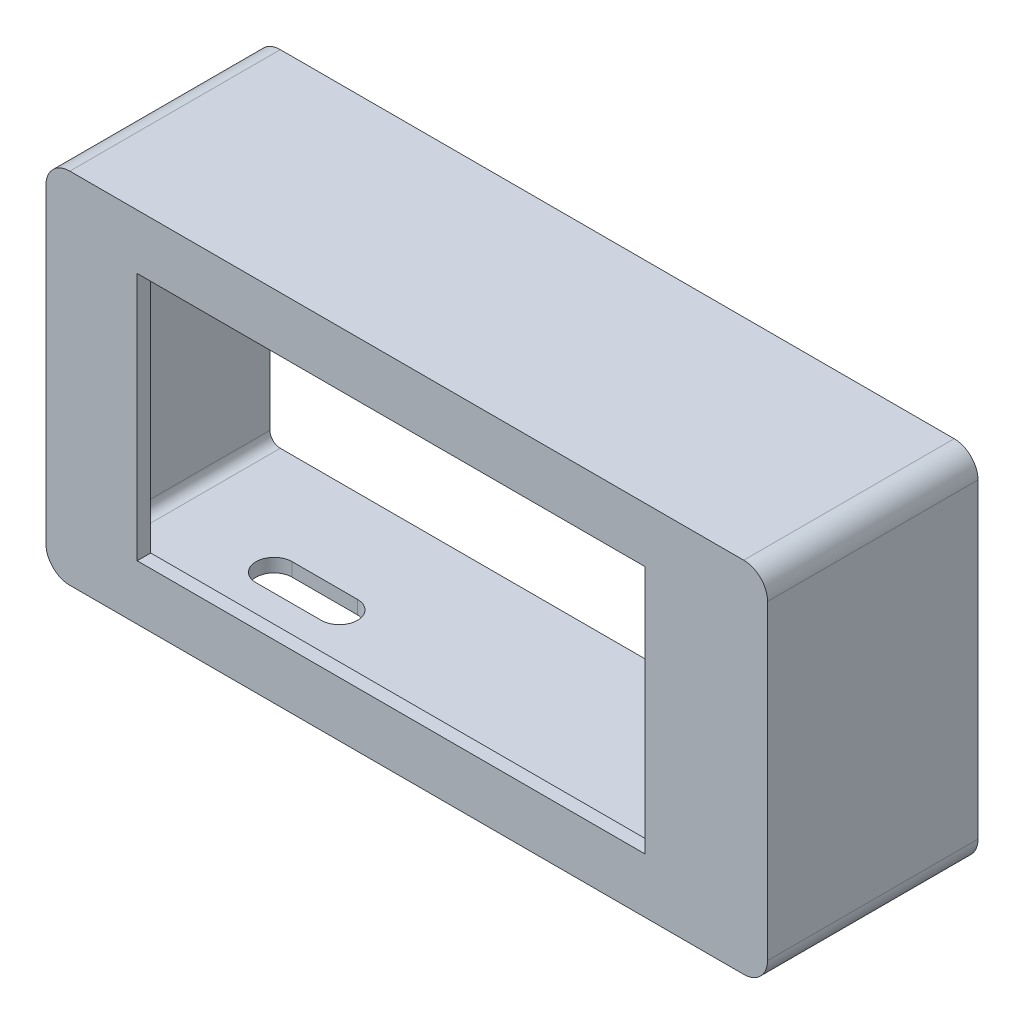
ISO-10303-21;
HEADER;
FILE_DESCRIPTION(('STEP AP214'),'2;1');
FILE_NAME('part.step','',(''),(''),'','','');
FILE_SCHEMA(('AUTOMOTIVE_DESIGN { 1 0 10303 214 1 1 1 1 }'));
ENDSEC;
DATA;
#1=APPLICATION_CONTEXT('core data for automotive mechanical design processes');
#2=APPLICATION_PROTOCOL_DEFINITION('international standard','automotive_design',2000,#1);
#3=PRODUCT_CONTEXT('',#1,'mechanical');
#4=PRODUCT('Part','Part','',(#3));
#5=PRODUCT_RELATED_PRODUCT_CATEGORY('part','',(#4));
#6=PRODUCT_DEFINITION_FORMATION('','',#4);
#7=PRODUCT_DEFINITION_CONTEXT('part definition',#1,'design');
#8=PRODUCT_DEFINITION('design','',#6,#7);
#9=PRODUCT_DEFINITION_SHAPE('','',#8);
#10=(LENGTH_UNIT() NAMED_UNIT(*) SI_UNIT(.MILLI.,.METRE.));
#11=(NAMED_UNIT(*) PLANE_ANGLE_UNIT() SI_UNIT($,.RADIAN.));
#12=(NAMED_UNIT(*) SI_UNIT($,.STERADIAN.) SOLID_ANGLE_UNIT());
#13=UNCERTAINTY_MEASURE_WITH_UNIT(LENGTH_MEASURE(1.E-05),#10,'distance_accuracy_value','');
#14=(GEOMETRIC_REPRESENTATION_CONTEXT(3) GLOBAL_UNCERTAINTY_ASSIGNED_CONTEXT((#13)) GLOBAL_UNIT_ASSIGNED_CONTEXT((#10,
#11,#12)) REPRESENTATION_CONTEXT('',''));
#15=CARTESIAN_POINT('',(0.,0.,0.));
#16=DIRECTION('',(0.,0.,1.));
#17=DIRECTION('',(1.,0.,0.));
#18=AXIS2_PLACEMENT_3D('',#15,#16,#17);
#19=CARTESIAN_POINT('',(67.,16.,9.5));
#20=DIRECTION('',(0.,-1.,0.));
#21=DIRECTION('',(0.,0.,-1.));
#22=AXIS2_PLACEMENT_3D('',#19,#20,#21);
#23=PLANE('',#22);
#24=DIRECTION('',(-1.,0.,0.));
#25=VECTOR('',#24,1.);
#26=CARTESIAN_POINT('',(67.,16.,-9.5));
#27=LINE('',#26,#25);
#28=CARTESIAN_POINT('',(66.,16.,-9.5));
#29=VERTEX_POINT('',#28);
#30=CARTESIAN_POINT('',(1.,16.,-9.5));
#31=VERTEX_POINT('',#30);
#32=EDGE_CURVE('E372',#29,#31,#27,.T.);
#33=ORIENTED_EDGE('',*,*,#32,.F.);
#34=DIRECTION('',(0.,0.,1.));
#35=VECTOR('',#34,1.);
#36=CARTESIAN_POINT('',(66.,16.,9.5));
#37=LINE('',#36,#35);
#38=CARTESIAN_POINT('',(66.,16.,9.5));
#39=VERTEX_POINT('',#38);
#40=EDGE_CURVE('E404',#39,#29,#37,.F.);
#41=ORIENTED_EDGE('',*,*,#40,.F.);
#42=DIRECTION('',(-1.,0.,0.));
#43=VECTOR('',#42,1.);
#44=CARTESIAN_POINT('',(67.,16.,9.5));
#45=LINE('',#44,#43);
#46=CARTESIAN_POINT('',(1.,16.,9.5));
#47=VERTEX_POINT('',#46);
#48=EDGE_CURVE('E369',#39,#47,#45,.T.);
#49=ORIENTED_EDGE('',*,*,#48,.T.);
#50=DIRECTION('',(0.,0.,1.));
#51=VECTOR('',#50,1.);
#52=CARTESIAN_POINT('',(1.,16.,9.5));
#53=LINE('',#52,#51);
#54=EDGE_CURVE('E407',#31,#47,#53,.T.);
#55=ORIENTED_EDGE('',*,*,#54,.F.);
#56=EDGE_LOOP('',(#33,#41,#49,#55));
#57=FACE_BOUND('',#56,.T.);
#58=DIRECTION('',(1.,0.,0.));
#59=VECTOR('',#58,1.);
#60=CARTESIAN_POINT('',(7.43067392756928,16.,1.));
#61=LINE('',#60,#59);
#62=CARTESIAN_POINT('',(7.43067392756928,16.,1.));
#63=VERTEX_POINT('',#62);
#64=CARTESIAN_POINT('',(13.2167778152242,16.,1.));
#65=VERTEX_POINT('',#64);
#66=EDGE_CURVE('E271',#63,#65,#61,.T.);
#67=ORIENTED_EDGE('',*,*,#66,.F.);
#68=DIRECTION('',(0.,0.,-1.));
#69=VECTOR('',#68,1.);
#70=CARTESIAN_POINT('',(7.43067392756928,16.,3.));
#71=LINE('',#70,#69);
#72=CARTESIAN_POINT('',(7.43067392756928,16.,3.));
#73=VERTEX_POINT('',#72);
#74=EDGE_CURVE('E268',#73,#63,#71,.T.);
#75=ORIENTED_EDGE('',*,*,#74,.F.);
#76=DIRECTION('',(-1.,0.,0.));
#77=VECTOR('',#76,1.);
#78=CARTESIAN_POINT('',(7.43067392756928,16.,3.));
#79=LINE('',#78,#77);
#80=CARTESIAN_POINT('',(13.2167778152242,16.,3.));
#81=VERTEX_POINT('',#80);
#82=EDGE_CURVE('E280',#81,#73,#79,.T.);
#83=ORIENTED_EDGE('',*,*,#82,.F.);
#84=DIRECTION('',(0.,0.,1.));
#85=VECTOR('',#84,1.);
#86=CARTESIAN_POINT('',(13.2167778152242,16.,3.));
#87=LINE('',#86,#85);
#88=EDGE_CURVE('E288',#65,#81,#87,.T.);
#89=ORIENTED_EDGE('',*,*,#88,.F.);
#90=EDGE_LOOP('',(#67,#75,#83,#89));
#91=FACE_BOUND('',#90,.T.);
#92=DIRECTION('',(1.,0.,0.));
#93=VECTOR('',#92,1.);
#94=CARTESIAN_POINT('',(55.2382145754227,16.,1.));
#95=LINE('',#94,#93);
#96=CARTESIAN_POINT('',(55.2382145754227,16.,1.));
#97=VERTEX_POINT('',#96);
#98=CARTESIAN_POINT('',(61.0472777233039,16.,1.));
#99=VERTEX_POINT('',#98);
#100=EDGE_CURVE('E895',#97,#99,#95,.T.);
#101=ORIENTED_EDGE('',*,*,#100,.F.);
#102=DIRECTION('',(0.,0.,-1.));
#103=VECTOR('',#102,1.);
#104=CARTESIAN_POINT('',(55.2382145754227,16.,1.));
#105=LINE('',#104,#103);
#106=CARTESIAN_POINT('',(55.2382145754227,16.,3.));
#107=VERTEX_POINT('',#106);
#108=EDGE_CURVE('E266',#107,#97,#105,.T.);
#109=ORIENTED_EDGE('',*,*,#108,.F.);
#110=DIRECTION('',(-1.,0.,0.));
#111=VECTOR('',#110,1.);
#112=CARTESIAN_POINT('',(55.2382145754227,16.,3.));
#113=LINE('',#112,#111);
#114=CARTESIAN_POINT('',(61.0472777233039,16.,3.));
#115=VERTEX_POINT('',#114);
#116=EDGE_CURVE('E262',#115,#107,#113,.T.);
#117=ORIENTED_EDGE('',*,*,#116,.F.);
#118=DIRECTION('',(0.,0.,1.));
#119=VECTOR('',#118,1.);
#120=CARTESIAN_POINT('',(61.0472777233039,16.,1.));
#121=LINE('',#120,#119);
#122=EDGE_CURVE('E892',#99,#115,#121,.T.);
#123=ORIENTED_EDGE('',*,*,#122,.F.);
#124=EDGE_LOOP('',(#101,#109,#117,#123));
#125=FACE_BOUND('',#124,.T.);
#126=ADVANCED_FACE('F34',(#57,#91,#125),#23,.T.);
#127=CARTESIAN_POINT('',(67.,-16.,-9.5));
#128=DIRECTION('',(0.,0.,1.));
#129=DIRECTION('',(1.,0.,0.));
#130=AXIS2_PLACEMENT_3D('',#127,#128,#129);
#131=PLANE('',#130);
#132=DIRECTION('',(0.,1.,0.));
#133=VECTOR('',#132,1.);
#134=CARTESIAN_POINT('',(68.3,0.,-9.5));
#135=LINE('',#134,#133);
#136=CARTESIAN_POINT('',(68.3,-15.,-9.5));
#137=VERTEX_POINT('',#136);
#138=CARTESIAN_POINT('',(68.3,15.,-9.5));
#139=VERTEX_POINT('',#138);
#140=EDGE_CURVE('E433',#137,#139,#135,.T.);
#141=ORIENTED_EDGE('',*,*,#140,.F.);
#142=CARTESIAN_POINT('',(66.,-15.,-9.5));
#143=DIRECTION('',(0.,0.,1.));
#144=DIRECTION('',(1.,0.,0.));
#145=AXIS2_PLACEMENT_3D('',#142,#143,#144);
#146=CIRCLE('',#145,2.3);
#147=CARTESIAN_POINT('',(66.,-17.3,-9.5));
#148=VERTEX_POINT('',#147);
#149=EDGE_CURVE('E447',#137,#148,#146,.F.);
#150=ORIENTED_EDGE('',*,*,#149,.T.);
#151=DIRECTION('',(-1.,0.,0.));
#152=VECTOR('',#151,1.);
#153=CARTESIAN_POINT('',(67.,-17.3,-9.5));
#154=LINE('',#153,#152);
#155=CARTESIAN_POINT('',(1.,-17.3,-9.5));
#156=VERTEX_POINT('',#155);
#157=EDGE_CURVE('E425',#148,#156,#154,.T.);
#158=ORIENTED_EDGE('',*,*,#157,.T.);
#159=CARTESIAN_POINT('',(1.,-15.,-9.5));
#160=DIRECTION('',(0.,0.,1.));
#161=DIRECTION('',(1.,0.,0.));
#162=AXIS2_PLACEMENT_3D('',#159,#160,#161);
#163=CIRCLE('',#162,2.3);
#164=CARTESIAN_POINT('',(-1.3,-15.,-9.5));
#165=VERTEX_POINT('',#164);
#166=EDGE_CURVE('E464',#156,#165,#163,.F.);
#167=ORIENTED_EDGE('',*,*,#166,.T.);
#168=DIRECTION('',(0.,1.,0.));
#169=VECTOR('',#168,1.);
#170=CARTESIAN_POINT('',(-1.3,0.,-9.5));
#171=LINE('',#170,#169);
#172=CARTESIAN_POINT('',(-1.3,15.,-9.5));
#173=VERTEX_POINT('',#172);
#174=EDGE_CURVE('E410',#165,#173,#171,.T.);
#175=ORIENTED_EDGE('',*,*,#174,.T.);
#176=CARTESIAN_POINT('',(1.,15.,-9.5));
#177=DIRECTION('',(0.,0.,1.));
#178=DIRECTION('',(1.,0.,0.));
#179=AXIS2_PLACEMENT_3D('',#176,#177,#178);
#180=CIRCLE('',#179,2.3);
#181=CARTESIAN_POINT('',(1.,17.3,-9.5));
#182=VERTEX_POINT('',#181);
#183=EDGE_CURVE('E460',#173,#182,#180,.F.);
#184=ORIENTED_EDGE('',*,*,#183,.T.);
#185=DIRECTION('',(-1.,0.,0.));
#186=VECTOR('',#185,1.);
#187=CARTESIAN_POINT('',(67.,17.3,-9.5));
#188=LINE('',#187,#186);
#189=CARTESIAN_POINT('',(66.,17.3,-9.5));
#190=VERTEX_POINT('',#189);
#191=EDGE_CURVE('E419',#190,#182,#188,.T.);
#192=ORIENTED_EDGE('',*,*,#191,.F.);
#193=CARTESIAN_POINT('',(66.,15.,-9.5));
#194=DIRECTION('',(0.,0.,1.));
#195=DIRECTION('',(1.,0.,0.));
#196=AXIS2_PLACEMENT_3D('',#193,#194,#195);
#197=CIRCLE('',#196,2.3);
#198=EDGE_CURVE('E451',#190,#139,#197,.F.);
#199=ORIENTED_EDGE('',*,*,#198,.T.);
#200=EDGE_LOOP('',(#141,#150,#158,#167,#175,#184,#192,#199));
#201=FACE_BOUND('',#200,.T.);
#202=CARTESIAN_POINT('',(66.,-15.,-9.5));
#203=DIRECTION('',(0.,0.,1.));
#204=DIRECTION('',(1.,0.,0.));
#205=AXIS2_PLACEMENT_3D('',#202,#203,#204);
#206=CIRCLE('',#205,1.);
#207=CARTESIAN_POINT('',(67.,-15.,-9.5));
#208=VERTEX_POINT('',#207);
#209=CARTESIAN_POINT('',(66.,-16.,-9.5));
#210=VERTEX_POINT('',#209);
#211=EDGE_CURVE('E386',#208,#210,#206,.F.);
#212=ORIENTED_EDGE('',*,*,#211,.F.);
#213=DIRECTION('',(0.,1.,0.));
#214=VECTOR('',#213,1.);
#215=CARTESIAN_POINT('',(67.,-16.,-9.5));
#216=LINE('',#215,#214);
#217=CARTESIAN_POINT('',(67.,15.,-9.5));
#218=VERTEX_POINT('',#217);
#219=EDGE_CURVE('E352',#208,#218,#216,.T.);
#220=ORIENTED_EDGE('',*,*,#219,.T.);
#221=CARTESIAN_POINT('',(66.,15.,-9.5));
#222=DIRECTION('',(0.,0.,1.));
#223=DIRECTION('',(1.,0.,0.));
#224=AXIS2_PLACEMENT_3D('',#221,#222,#223);
#225=CIRCLE('',#224,1.);
#226=EDGE_CURVE('E380',#29,#218,#225,.F.);
#227=ORIENTED_EDGE('',*,*,#226,.F.);
#228=ORIENTED_EDGE('',*,*,#32,.T.);
#229=CARTESIAN_POINT('',(1.,15.,-9.5));
#230=DIRECTION('',(0.,0.,1.));
#231=DIRECTION('',(1.,0.,0.));
#232=AXIS2_PLACEMENT_3D('',#229,#230,#231);
#233=CIRCLE('',#232,1.);
#234=CARTESIAN_POINT('',(0.,15.,-9.5));
#235=VERTEX_POINT('',#234);
#236=EDGE_CURVE('E382',#235,#31,#233,.F.);
#237=ORIENTED_EDGE('',*,*,#236,.F.);
#238=DIRECTION('',(0.,1.,0.));
#239=VECTOR('',#238,1.);
#240=CARTESIAN_POINT('',(0.,-16.,-9.5));
#241=LINE('',#240,#239);
#242=CARTESIAN_POINT('',(0.,-15.,-9.5));
#243=VERTEX_POINT('',#242);
#244=EDGE_CURVE('E345',#243,#235,#241,.T.);
#245=ORIENTED_EDGE('',*,*,#244,.F.);
#246=CARTESIAN_POINT('',(1.,-15.,-9.5));
#247=DIRECTION('',(0.,0.,1.));
#248=DIRECTION('',(1.,0.,0.));
#249=AXIS2_PLACEMENT_3D('',#246,#247,#248);
#250=CIRCLE('',#249,1.);
#251=CARTESIAN_POINT('',(1.,-16.,-9.5));
#252=VERTEX_POINT('',#251);
#253=EDGE_CURVE('E384',#252,#243,#250,.F.);
#254=ORIENTED_EDGE('',*,*,#253,.F.);
#255=DIRECTION('',(-1.,0.,0.));
#256=VECTOR('',#255,1.);
#257=CARTESIAN_POINT('',(67.,-16.,-9.5));
#258=LINE('',#257,#256);
#259=EDGE_CURVE('E359',#210,#252,#258,.T.);
#260=ORIENTED_EDGE('',*,*,#259,.F.);
#261=EDGE_LOOP('',(#212,#220,#227,#228,#237,#245,#254,#260));
#262=FACE_BOUND('',#261,.T.);
#263=ADVANCED_FACE('F518',(#201,#262),#131,.F.);
#264=CARTESIAN_POINT('',(67.,17.3,9.5));
#265=DIRECTION('',(0.,-1.,0.));
#266=DIRECTION('',(0.,0.,-1.));
#267=AXIS2_PLACEMENT_3D('',#264,#265,#266);
#268=PLANE('',#267);
#269=ORIENTED_EDGE('',*,*,#191,.T.);
#270=DIRECTION('',(0.,0.,-1.));
#271=VECTOR('',#270,1.);
#272=CARTESIAN_POINT('',(1.,17.3,9.5));
#273=LINE('',#272,#271);
#274=CARTESIAN_POINT('',(1.,17.3,10.8));
#275=VERTEX_POINT('',#274);
#276=EDGE_CURVE('E411',#182,#275,#273,.F.);
#277=ORIENTED_EDGE('',*,*,#276,.T.);
#278=DIRECTION('',(-1.,0.,0.));
#279=VECTOR('',#278,1.);
#280=CARTESIAN_POINT('',(67.,17.3,10.8));
#281=LINE('',#280,#279);
#282=CARTESIAN_POINT('',(66.,17.3,10.8));
#283=VERTEX_POINT('',#282);
#284=EDGE_CURVE('E416',#283,#275,#281,.T.);
#285=ORIENTED_EDGE('',*,*,#284,.F.);
#286=DIRECTION('',(0.,0.,-1.));
#287=VECTOR('',#286,1.);
#288=CARTESIAN_POINT('',(66.,17.3,9.5));
#289=LINE('',#288,#287);
#290=EDGE_CURVE('E415',#283,#190,#289,.T.);
#291=ORIENTED_EDGE('',*,*,#290,.T.);
#292=EDGE_LOOP('',(#269,#277,#285,#291));
#293=FACE_BOUND('',#292,.T.);
#294=ADVANCED_FACE('F501',(#293),#268,.F.);
#295=CARTESIAN_POINT('',(67.,-16.,10.8));
#296=DIRECTION('',(0.,0.,-1.));
#297=DIRECTION('',(-1.,0.,0.));
#298=AXIS2_PLACEMENT_3D('',#295,#296,#297);
#299=PLANE('',#298);
#300=DIRECTION('',(1.,0.,0.));
#301=VECTOR('',#300,1.);
#302=CARTESIAN_POINT('',(7.50000000000001,-12.,10.8));
#303=LINE('',#302,#301);
#304=CARTESIAN_POINT('',(7.50000000000001,-12.,10.8));
#305=VERTEX_POINT('',#304);
#306=CARTESIAN_POINT('',(56.5,-12.,10.8));
#307=VERTEX_POINT('',#306);
#308=EDGE_CURVE('E333',#305,#307,#303,.T.);
#309=ORIENTED_EDGE('',*,*,#308,.F.);
#310=DIRECTION('',(0.,-1.,0.));
#311=VECTOR('',#310,1.);
#312=CARTESIAN_POINT('',(7.50000000000001,12.,10.8));
#313=LINE('',#312,#311);
#314=CARTESIAN_POINT('',(7.50000000000001,12.,10.8));
#315=VERTEX_POINT('',#314);
#316=EDGE_CURVE('E331',#315,#305,#313,.T.);
#317=ORIENTED_EDGE('',*,*,#316,.F.);
#318=DIRECTION('',(-1.,0.,0.));
#319=VECTOR('',#318,1.);
#320=CARTESIAN_POINT('',(7.50000000000001,12.,10.8));
#321=LINE('',#320,#319);
#322=CARTESIAN_POINT('',(56.5,12.,10.8));
#323=VERTEX_POINT('',#322);
#324=EDGE_CURVE('E339',#323,#315,#321,.T.);
#325=ORIENTED_EDGE('',*,*,#324,.F.);
#326=DIRECTION('',(0.,1.,0.));
#327=VECTOR('',#326,1.);
#328=CARTESIAN_POINT('',(56.5,12.,10.8));
#329=LINE('',#328,#327);
#330=EDGE_CURVE('E336',#307,#323,#329,.T.);
#331=ORIENTED_EDGE('',*,*,#330,.F.);
#332=EDGE_LOOP('',(#309,#317,#325,#331));
#333=FACE_BOUND('',#332,.T.);
#334=DIRECTION('',(-1.,0.,0.));
#335=VECTOR('',#334,1.);
#336=CARTESIAN_POINT('',(67.,-17.3,10.8));
#337=LINE('',#336,#335);
#338=CARTESIAN_POINT('',(66.,-17.3,10.8));
#339=VERTEX_POINT('',#338);
#340=CARTESIAN_POINT('',(1.,-17.3,10.8));
#341=VERTEX_POINT('',#340);
#342=EDGE_CURVE('E420',#339,#341,#337,.T.);
#343=ORIENTED_EDGE('',*,*,#342,.F.);
#344=CARTESIAN_POINT('',(66.,-15.,10.8));
#345=DIRECTION('',(0.,0.,-1.));
#346=DIRECTION('',(-1.,0.,0.));
#347=AXIS2_PLACEMENT_3D('',#344,#345,#346);
#348=CIRCLE('',#347,2.3);
#349=CARTESIAN_POINT('',(68.3,-15.,10.8));
#350=VERTEX_POINT('',#349);
#351=EDGE_CURVE('E426',#339,#350,#348,.F.);
#352=ORIENTED_EDGE('',*,*,#351,.T.);
#353=DIRECTION('',(0.,-1.,0.));
#354=VECTOR('',#353,1.);
#355=CARTESIAN_POINT('',(68.3,0.,10.8));
#356=LINE('',#355,#354);
#357=CARTESIAN_POINT('',(68.3,15.,10.8));
#358=VERTEX_POINT('',#357);
#359=EDGE_CURVE('E430',#358,#350,#356,.T.);
#360=ORIENTED_EDGE('',*,*,#359,.F.);
#361=CARTESIAN_POINT('',(66.,15.,10.8));
#362=DIRECTION('',(0.,0.,-1.));
#363=DIRECTION('',(-1.,0.,0.));
#364=AXIS2_PLACEMENT_3D('',#361,#362,#363);
#365=CIRCLE('',#364,2.3);
#366=EDGE_CURVE('E434',#358,#283,#365,.F.);
#367=ORIENTED_EDGE('',*,*,#366,.T.);
#368=ORIENTED_EDGE('',*,*,#284,.T.);
#369=CARTESIAN_POINT('',(1.,15.,10.8));
#370=DIRECTION('',(0.,0.,-1.));
#371=DIRECTION('',(-1.,0.,0.));
#372=AXIS2_PLACEMENT_3D('',#369,#370,#371);
#373=CIRCLE('',#372,2.3);
#374=CARTESIAN_POINT('',(-1.3,15.,10.8));
#375=VERTEX_POINT('',#374);
#376=EDGE_CURVE('E436',#275,#375,#373,.F.);
#377=ORIENTED_EDGE('',*,*,#376,.T.);
#378=DIRECTION('',(0.,-1.,0.));
#379=VECTOR('',#378,1.);
#380=CARTESIAN_POINT('',(-1.3,0.,10.8));
#381=LINE('',#380,#379);
#382=CARTESIAN_POINT('',(-1.3,-15.,10.8));
#383=VERTEX_POINT('',#382);
#384=EDGE_CURVE('E439',#375,#383,#381,.T.);
#385=ORIENTED_EDGE('',*,*,#384,.T.);
#386=CARTESIAN_POINT('',(1.,-15.,10.8));
#387=DIRECTION('',(0.,0.,-1.));
#388=DIRECTION('',(-1.,0.,0.));
#389=AXIS2_PLACEMENT_3D('',#386,#387,#388);
#390=CIRCLE('',#389,2.3);
#391=EDGE_CURVE('E429',#383,#341,#390,.F.);
#392=ORIENTED_EDGE('',*,*,#391,.T.);
#393=EDGE_LOOP('',(#343,#352,#360,#367,#368,#377,#385,#392));
#394=FACE_BOUND('',#393,.T.);
#395=ADVANCED_FACE('F497',(#333,#394),#299,.F.);
#396=CARTESIAN_POINT('',(67.,-17.3,9.5));
#397=DIRECTION('',(0.,1.,0.));
#398=DIRECTION('',(0.,0.,1.));
#399=AXIS2_PLACEMENT_3D('',#396,#397,#398);
#400=PLANE('',#399);
#401=CARTESIAN_POINT('',(17.35,-17.3,1.15));
#402=DIRECTION('',(0.,-1.,0.));
#403=DIRECTION('',(0.,0.,-1.));
#404=AXIS2_PLACEMENT_3D('',#401,#402,#403);
#405=CIRCLE('',#404,1.75);
#406=CARTESIAN_POINT('',(17.35,-17.3,-0.599999999999997));
#407=VERTEX_POINT('',#406);
#408=CARTESIAN_POINT('',(17.35,-17.3,2.9));
#409=VERTEX_POINT('',#408);
#410=EDGE_CURVE('E314',#407,#409,#405,.T.);
#411=ORIENTED_EDGE('',*,*,#410,.F.);
#412=DIRECTION('',(1.,0.,0.));
#413=VECTOR('',#412,1.);
#414=CARTESIAN_POINT('',(11.05,-17.3,-0.599999999999997));
#415=LINE('',#414,#413);
#416=CARTESIAN_POINT('',(11.05,-17.3,-0.599999999999997));
#417=VERTEX_POINT('',#416);
#418=EDGE_CURVE('E311',#417,#407,#415,.T.);
#419=ORIENTED_EDGE('',*,*,#418,.F.);
#420=CARTESIAN_POINT('',(11.05,-17.3,1.15));
#421=DIRECTION('',(0.,-1.,0.));
#422=DIRECTION('',(0.,0.,-1.));
#423=AXIS2_PLACEMENT_3D('',#420,#421,#422);
#424=CIRCLE('',#423,1.75);
#425=CARTESIAN_POINT('',(11.05,-17.3,2.9));
#426=VERTEX_POINT('',#425);
#427=EDGE_CURVE('E308',#426,#417,#424,.T.);
#428=ORIENTED_EDGE('',*,*,#427,.F.);
#429=DIRECTION('',(-1.,0.,0.));
#430=VECTOR('',#429,1.);
#431=CARTESIAN_POINT('',(11.05,-17.3,2.9));
#432=LINE('',#431,#430);
#433=EDGE_CURVE('E317',#409,#426,#432,.T.);
#434=ORIENTED_EDGE('',*,*,#433,.F.);
#435=EDGE_LOOP('',(#411,#419,#428,#434));
#436=FACE_BOUND('',#435,.T.);
#437=ORIENTED_EDGE('',*,*,#157,.F.);
#438=DIRECTION('',(0.,0.,1.));
#439=VECTOR('',#438,1.);
#440=CARTESIAN_POINT('',(66.,-17.3,9.5));
#441=LINE('',#440,#439);
#442=EDGE_CURVE('E437',#148,#339,#441,.T.);
#443=ORIENTED_EDGE('',*,*,#442,.T.);
#444=ORIENTED_EDGE('',*,*,#342,.T.);
#445=DIRECTION('',(0.,0.,1.));
#446=VECTOR('',#445,1.);
#447=CARTESIAN_POINT('',(1.,-17.3,9.5));
#448=LINE('',#447,#446);
#449=EDGE_CURVE('E444',#341,#156,#448,.F.);
#450=ORIENTED_EDGE('',*,*,#449,.T.);
#451=EDGE_LOOP('',(#437,#443,#444,#450));
#452=FACE_BOUND('',#451,.T.);
#453=ADVANCED_FACE('F500',(#436,#452),#400,.F.);
#454=CARTESIAN_POINT('',(68.3,0.,0.));
#455=DIRECTION('',(-1.,0.,0.));
#456=DIRECTION('',(0.,0.,1.));
#457=AXIS2_PLACEMENT_3D('',#454,#455,#456);
#458=PLANE('',#457);
#459=ORIENTED_EDGE('',*,*,#359,.T.);
#460=DIRECTION('',(0.,0.,1.));
#461=VECTOR('',#460,1.);
#462=CARTESIAN_POINT('',(68.3,-15.,0.));
#463=LINE('',#462,#461);
#464=EDGE_CURVE('E448',#350,#137,#463,.F.);
#465=ORIENTED_EDGE('',*,*,#464,.T.);
#466=ORIENTED_EDGE('',*,*,#140,.T.);
#467=DIRECTION('',(0.,0.,1.));
#468=VECTOR('',#467,1.);
#469=CARTESIAN_POINT('',(68.3,15.,0.));
#470=LINE('',#469,#468);
#471=EDGE_CURVE('E452',#139,#358,#470,.T.);
#472=ORIENTED_EDGE('',*,*,#471,.T.);
#473=EDGE_LOOP('',(#459,#465,#466,#472));
#474=FACE_BOUND('',#473,.T.);
#475=ADVANCED_FACE('F515',(#474),#458,.F.);
#476=CARTESIAN_POINT('',(-1.3,0.,0.));
#477=DIRECTION('',(-1.,0.,0.));
#478=DIRECTION('',(0.,0.,1.));
#479=AXIS2_PLACEMENT_3D('',#476,#477,#478);
#480=PLANE('',#479);
#481=ORIENTED_EDGE('',*,*,#174,.F.);
#482=DIRECTION('',(0.,0.,1.));
#483=VECTOR('',#482,1.);
#484=CARTESIAN_POINT('',(-1.3,-15.,0.));
#485=LINE('',#484,#483);
#486=EDGE_CURVE('E422',#165,#383,#485,.T.);
#487=ORIENTED_EDGE('',*,*,#486,.T.);
#488=ORIENTED_EDGE('',*,*,#384,.F.);
#489=DIRECTION('',(0.,0.,1.));
#490=VECTOR('',#489,1.);
#491=CARTESIAN_POINT('',(-1.3,15.,0.));
#492=LINE('',#491,#490);
#493=EDGE_CURVE('E428',#375,#173,#492,.F.);
#494=ORIENTED_EDGE('',*,*,#493,.T.);
#495=EDGE_LOOP('',(#481,#487,#488,#494));
#496=FACE_BOUND('',#495,.T.);
#497=ADVANCED_FACE('F535',(#496),#480,.T.);
#498=CARTESIAN_POINT('',(66.,-15.,0.));
#499=DIRECTION('',(0.,0.,-1.));
#500=DIRECTION('',(-1.,0.,0.));
#501=AXIS2_PLACEMENT_3D('',#498,#499,#500);
#502=CYLINDRICAL_SURFACE('',#501,2.3);
#503=ORIENTED_EDGE('',*,*,#351,.F.);
#504=ORIENTED_EDGE('',*,*,#442,.F.);
#505=ORIENTED_EDGE('',*,*,#149,.F.);
#506=ORIENTED_EDGE('',*,*,#464,.F.);
#507=EDGE_LOOP('',(#503,#504,#505,#506));
#508=FACE_BOUND('',#507,.T.);
#509=ADVANCED_FACE('F512',(#508),#502,.T.);
#510=CARTESIAN_POINT('',(1.,-15.,9.5));
#511=DIRECTION('',(0.,0.,1.));
#512=DIRECTION('',(1.,0.,0.));
#513=AXIS2_PLACEMENT_3D('',#510,#511,#512);
#514=CYLINDRICAL_SURFACE('',#513,2.3);
#515=ORIENTED_EDGE('',*,*,#391,.F.);
#516=ORIENTED_EDGE('',*,*,#486,.F.);
#517=ORIENTED_EDGE('',*,*,#166,.F.);
#518=ORIENTED_EDGE('',*,*,#449,.F.);
#519=EDGE_LOOP('',(#515,#516,#517,#518));
#520=FACE_BOUND('',#519,.T.);
#521=ADVANCED_FACE('F538',(#520),#514,.T.);
#522=CARTESIAN_POINT('',(1.,15.,9.5));
#523=DIRECTION('',(0.,0.,-1.));
#524=DIRECTION('',(-1.,0.,0.));
#525=AXIS2_PLACEMENT_3D('',#522,#523,#524);
#526=CYLINDRICAL_SURFACE('',#525,2.3);
#527=ORIENTED_EDGE('',*,*,#183,.F.);
#528=ORIENTED_EDGE('',*,*,#493,.F.);
#529=ORIENTED_EDGE('',*,*,#376,.F.);
#530=ORIENTED_EDGE('',*,*,#276,.F.);
#531=EDGE_LOOP('',(#527,#528,#529,#530));
#532=FACE_BOUND('',#531,.T.);
#533=ADVANCED_FACE('F530',(#532),#526,.T.);
#534=CARTESIAN_POINT('',(66.,15.,0.));
#535=DIRECTION('',(0.,0.,1.));
#536=DIRECTION('',(1.,0.,0.));
#537=AXIS2_PLACEMENT_3D('',#534,#535,#536);
#538=CYLINDRICAL_SURFACE('',#537,2.3);
#539=ORIENTED_EDGE('',*,*,#198,.F.);
#540=ORIENTED_EDGE('',*,*,#290,.F.);
#541=ORIENTED_EDGE('',*,*,#366,.F.);
#542=ORIENTED_EDGE('',*,*,#471,.F.);
#543=EDGE_LOOP('',(#539,#540,#541,#542));
#544=FACE_BOUND('',#543,.T.);
#545=ADVANCED_FACE('F36',(#544),#538,.T.);
#546=CARTESIAN_POINT('',(67.,-16.,9.5));
#547=DIRECTION('',(0.,0.,-1.));
#548=DIRECTION('',(-1.,0.,0.));
#549=AXIS2_PLACEMENT_3D('',#546,#547,#548);
#550=PLANE('',#549);
#551=DIRECTION('',(0.,1.,0.));
#552=VECTOR('',#551,1.);
#553=CARTESIAN_POINT('',(7.50000000000001,-16.,9.5));
#554=LINE('',#553,#552);
#555=CARTESIAN_POINT('',(7.50000000000001,-12.,9.5));
#556=VERTEX_POINT('',#555);
#557=CARTESIAN_POINT('',(7.50000000000001,12.,9.5));
#558=VERTEX_POINT('',#557);
#559=EDGE_CURVE('E12',#556,#558,#554,.T.);
#560=ORIENTED_EDGE('',*,*,#559,.F.);
#561=DIRECTION('',(-1.,0.,0.));
#562=VECTOR('',#561,1.);
#563=CARTESIAN_POINT('',(67.,-12.,9.5));
#564=LINE('',#563,#562);
#565=CARTESIAN_POINT('',(56.5,-12.,9.5));
#566=VERTEX_POINT('',#565);
#567=EDGE_CURVE('E414',#566,#556,#564,.T.);
#568=ORIENTED_EDGE('',*,*,#567,.F.);
#569=DIRECTION('',(0.,-1.,0.));
#570=VECTOR('',#569,1.);
#571=CARTESIAN_POINT('',(56.5,-16.,9.5));
#572=LINE('',#571,#570);
#573=CARTESIAN_POINT('',(56.5,12.,9.5));
#574=VERTEX_POINT('',#573);
#575=EDGE_CURVE('E472',#574,#566,#572,.T.);
#576=ORIENTED_EDGE('',*,*,#575,.F.);
#577=DIRECTION('',(1.,0.,0.));
#578=VECTOR('',#577,1.);
#579=CARTESIAN_POINT('',(67.,12.,9.5));
#580=LINE('',#579,#578);
#581=EDGE_CURVE('E42',#558,#574,#580,.T.);
#582=ORIENTED_EDGE('',*,*,#581,.F.);
#583=EDGE_LOOP('',(#560,#568,#576,#582));
#584=FACE_BOUND('',#583,.T.);
#585=DIRECTION('',(-1.,0.,0.));
#586=VECTOR('',#585,1.);
#587=CARTESIAN_POINT('',(67.,-16.,9.5));
#588=LINE('',#587,#586);
#589=CARTESIAN_POINT('',(66.,-16.,9.5));
#590=VERTEX_POINT('',#589);
#591=CARTESIAN_POINT('',(1.,-16.,9.5));
#592=VERTEX_POINT('',#591);
#593=EDGE_CURVE('E366',#590,#592,#588,.T.);
#594=ORIENTED_EDGE('',*,*,#593,.T.);
#595=CARTESIAN_POINT('',(1.,-15.,9.5));
#596=DIRECTION('',(0.,0.,-1.));
#597=DIRECTION('',(-1.,0.,0.));
#598=AXIS2_PLACEMENT_3D('',#595,#596,#597);
#599=CIRCLE('',#598,1.);
#600=CARTESIAN_POINT('',(0.,-15.,9.5));
#601=VERTEX_POINT('',#600);
#602=EDGE_CURVE('E396',#601,#592,#599,.F.);
#603=ORIENTED_EDGE('',*,*,#602,.F.);
#604=DIRECTION('',(0.,-1.,0.));
#605=VECTOR('',#604,1.);
#606=CARTESIAN_POINT('',(0.,-16.,9.5));
#607=LINE('',#606,#605);
#608=CARTESIAN_POINT('',(0.,15.,9.5));
#609=VERTEX_POINT('',#608);
#610=EDGE_CURVE('E356',#609,#601,#607,.T.);
#611=ORIENTED_EDGE('',*,*,#610,.F.);
#612=CARTESIAN_POINT('',(1.,15.,9.5));
#613=DIRECTION('',(0.,0.,-1.));
#614=DIRECTION('',(-1.,0.,0.));
#615=AXIS2_PLACEMENT_3D('',#612,#613,#614);
#616=CIRCLE('',#615,1.);
#617=EDGE_CURVE('E394',#47,#609,#616,.F.);
#618=ORIENTED_EDGE('',*,*,#617,.F.);
#619=ORIENTED_EDGE('',*,*,#48,.F.);
#620=CARTESIAN_POINT('',(66.,15.,9.5));
#621=DIRECTION('',(0.,0.,-1.));
#622=DIRECTION('',(-1.,0.,0.));
#623=AXIS2_PLACEMENT_3D('',#620,#621,#622);
#624=CIRCLE('',#623,1.);
#625=CARTESIAN_POINT('',(67.,15.,9.5));
#626=VERTEX_POINT('',#625);
#627=EDGE_CURVE('E392',#626,#39,#624,.F.);
#628=ORIENTED_EDGE('',*,*,#627,.F.);
#629=DIRECTION('',(0.,-1.,0.));
#630=VECTOR('',#629,1.);
#631=CARTESIAN_POINT('',(67.,-16.,9.5));
#632=LINE('',#631,#630);
#633=CARTESIAN_POINT('',(67.,-15.,9.5));
#634=VERTEX_POINT('',#633);
#635=EDGE_CURVE('E355',#626,#634,#632,.T.);
#636=ORIENTED_EDGE('',*,*,#635,.T.);
#637=CARTESIAN_POINT('',(66.,-15.,9.5));
#638=DIRECTION('',(0.,0.,-1.));
#639=DIRECTION('',(-1.,0.,0.));
#640=AXIS2_PLACEMENT_3D('',#637,#638,#639);
#641=CIRCLE('',#640,1.);
#642=EDGE_CURVE('E398',#590,#634,#641,.F.);
#643=ORIENTED_EDGE('',*,*,#642,.F.);
#644=EDGE_LOOP('',(#594,#603,#611,#618,#619,#628,#636,#643));
#645=FACE_BOUND('',#644,.T.);
#646=ADVANCED_FACE('F487',(#584,#645),#550,.T.);
#647=CARTESIAN_POINT('',(67.,-16.,9.5));
#648=DIRECTION('',(0.,1.,0.));
#649=DIRECTION('',(0.,0.,1.));
#650=AXIS2_PLACEMENT_3D('',#647,#648,#649);
#651=PLANE('',#650);
#652=DIRECTION('',(1.,0.,0.));
#653=VECTOR('',#652,1.);
#654=CARTESIAN_POINT('',(11.05,-16.,-0.599999999999997));
#655=LINE('',#654,#653);
#656=CARTESIAN_POINT('',(11.05,-16.,-0.599999999999997));
#657=VERTEX_POINT('',#656);
#658=CARTESIAN_POINT('',(17.35,-16.,-0.599999999999997));
#659=VERTEX_POINT('',#658);
#660=EDGE_CURVE('E323',#657,#659,#655,.T.);
#661=ORIENTED_EDGE('',*,*,#660,.T.);
#662=CARTESIAN_POINT('',(17.35,-16.,1.15));
#663=DIRECTION('',(0.,1.,0.));
#664=DIRECTION('',(0.,0.,1.));
#665=AXIS2_PLACEMENT_3D('',#662,#663,#664);
#666=CIRCLE('',#665,1.75);
#667=CARTESIAN_POINT('',(17.35,-16.,2.9));
#668=VERTEX_POINT('',#667);
#669=EDGE_CURVE('E299',#659,#668,#666,.F.);
#670=ORIENTED_EDGE('',*,*,#669,.T.);
#671=DIRECTION('',(-1.,0.,0.));
#672=VECTOR('',#671,1.);
#673=CARTESIAN_POINT('',(11.05,-16.,2.9));
#674=LINE('',#673,#672);
#675=CARTESIAN_POINT('',(11.05,-16.,2.9));
#676=VERTEX_POINT('',#675);
#677=EDGE_CURVE('E302',#668,#676,#674,.T.);
#678=ORIENTED_EDGE('',*,*,#677,.T.);
#679=CARTESIAN_POINT('',(11.05,-16.,1.15));
#680=DIRECTION('',(0.,1.,0.));
#681=DIRECTION('',(0.,0.,1.));
#682=AXIS2_PLACEMENT_3D('',#679,#680,#681);
#683=CIRCLE('',#682,1.75);
#684=EDGE_CURVE('E305',#676,#657,#683,.F.);
#685=ORIENTED_EDGE('',*,*,#684,.T.);
#686=EDGE_LOOP('',(#661,#670,#678,#685));
#687=FACE_BOUND('',#686,.T.);
#688=ORIENTED_EDGE('',*,*,#259,.T.);
#689=DIRECTION('',(0.,0.,-1.));
#690=VECTOR('',#689,1.);
#691=CARTESIAN_POINT('',(1.,-16.,-9.5));
#692=LINE('',#691,#690);
#693=EDGE_CURVE('E388',#592,#252,#692,.T.);
#694=ORIENTED_EDGE('',*,*,#693,.F.);
#695=ORIENTED_EDGE('',*,*,#593,.F.);
#696=DIRECTION('',(0.,0.,-1.));
#697=VECTOR('',#696,1.);
#698=CARTESIAN_POINT('',(66.,-16.,9.5));
#699=LINE('',#698,#697);
#700=EDGE_CURVE('E390',#210,#590,#699,.F.);
#701=ORIENTED_EDGE('',*,*,#700,.F.);
#702=EDGE_LOOP('',(#688,#694,#695,#701));
#703=FACE_BOUND('',#702,.T.);
#704=ADVANCED_FACE('F599',(#687,#703),#651,.T.);
#705=CARTESIAN_POINT('',(67.,0.,0.));
#706=DIRECTION('',(-1.,0.,0.));
#707=DIRECTION('',(0.,0.,1.));
#708=AXIS2_PLACEMENT_3D('',#705,#706,#707);
#709=PLANE('',#708);
#710=ORIENTED_EDGE('',*,*,#635,.F.);
#711=DIRECTION('',(0.,0.,1.));
#712=VECTOR('',#711,1.);
#713=CARTESIAN_POINT('',(67.,15.,0.));
#714=LINE('',#713,#712);
#715=EDGE_CURVE('E375',#218,#626,#714,.T.);
#716=ORIENTED_EDGE('',*,*,#715,.F.);
#717=ORIENTED_EDGE('',*,*,#219,.F.);
#718=DIRECTION('',(0.,0.,-1.));
#719=VECTOR('',#718,1.);
#720=CARTESIAN_POINT('',(67.,-15.,0.));
#721=LINE('',#720,#719);
#722=EDGE_CURVE('E378',#634,#208,#721,.T.);
#723=ORIENTED_EDGE('',*,*,#722,.F.);
#724=EDGE_LOOP('',(#710,#716,#717,#723));
#725=FACE_BOUND('',#724,.T.);
#726=ADVANCED_FACE('F649',(#725),#709,.T.);
#727=CARTESIAN_POINT('',(0.,0.,0.));
#728=DIRECTION('',(-1.,0.,0.));
#729=DIRECTION('',(0.,0.,1.));
#730=AXIS2_PLACEMENT_3D('',#727,#728,#729);
#731=PLANE('',#730);
#732=ORIENTED_EDGE('',*,*,#244,.T.);
#733=DIRECTION('',(0.,0.,1.));
#734=VECTOR('',#733,1.);
#735=CARTESIAN_POINT('',(0.,15.,-9.5));
#736=LINE('',#735,#734);
#737=EDGE_CURVE('E400',#609,#235,#736,.F.);
#738=ORIENTED_EDGE('',*,*,#737,.F.);
#739=ORIENTED_EDGE('',*,*,#610,.T.);
#740=DIRECTION('',(0.,0.,-1.));
#741=VECTOR('',#740,1.);
#742=CARTESIAN_POINT('',(0.,-15.,9.5));
#743=LINE('',#742,#741);
#744=EDGE_CURVE('E402',#243,#601,#743,.F.);
#745=ORIENTED_EDGE('',*,*,#744,.F.);
#746=EDGE_LOOP('',(#732,#738,#739,#745));
#747=FACE_BOUND('',#746,.T.);
#748=ADVANCED_FACE('F562',(#747),#731,.F.);
#749=CARTESIAN_POINT('',(66.,-15.,0.));
#750=DIRECTION('',(0.,0.,-1.));
#751=DIRECTION('',(-1.,0.,0.));
#752=AXIS2_PLACEMENT_3D('',#749,#750,#751);
#753=CYLINDRICAL_SURFACE('',#752,1.);
#754=ORIENTED_EDGE('',*,*,#642,.T.);
#755=ORIENTED_EDGE('',*,*,#722,.T.);
#756=ORIENTED_EDGE('',*,*,#211,.T.);
#757=ORIENTED_EDGE('',*,*,#700,.T.);
#758=EDGE_LOOP('',(#754,#755,#756,#757));
#759=FACE_BOUND('',#758,.T.);
#760=ADVANCED_FACE('F558',(#759),#753,.F.);
#761=CARTESIAN_POINT('',(1.,-15.,9.5));
#762=DIRECTION('',(0.,0.,1.));
#763=DIRECTION('',(1.,0.,0.));
#764=AXIS2_PLACEMENT_3D('',#761,#762,#763);
#765=CYLINDRICAL_SURFACE('',#764,1.);
#766=ORIENTED_EDGE('',*,*,#602,.T.);
#767=ORIENTED_EDGE('',*,*,#693,.T.);
#768=ORIENTED_EDGE('',*,*,#253,.T.);
#769=ORIENTED_EDGE('',*,*,#744,.T.);
#770=EDGE_LOOP('',(#766,#767,#768,#769));
#771=FACE_BOUND('',#770,.T.);
#772=ADVANCED_FACE('F561',(#771),#765,.F.);
#773=CARTESIAN_POINT('',(1.,15.,9.5));
#774=DIRECTION('',(0.,0.,-1.));
#775=DIRECTION('',(-1.,0.,0.));
#776=AXIS2_PLACEMENT_3D('',#773,#774,#775);
#777=CYLINDRICAL_SURFACE('',#776,1.);
#778=ORIENTED_EDGE('',*,*,#236,.T.);
#779=ORIENTED_EDGE('',*,*,#54,.T.);
#780=ORIENTED_EDGE('',*,*,#617,.T.);
#781=ORIENTED_EDGE('',*,*,#737,.T.);
#782=EDGE_LOOP('',(#778,#779,#780,#781));
#783=FACE_BOUND('',#782,.T.);
#784=ADVANCED_FACE('F566',(#783),#777,.F.);
#785=CARTESIAN_POINT('',(66.,15.,0.));
#786=DIRECTION('',(0.,0.,1.));
#787=DIRECTION('',(1.,0.,0.));
#788=AXIS2_PLACEMENT_3D('',#785,#786,#787);
#789=CYLINDRICAL_SURFACE('',#788,1.);
#790=ORIENTED_EDGE('',*,*,#226,.T.);
#791=ORIENTED_EDGE('',*,*,#715,.T.);
#792=ORIENTED_EDGE('',*,*,#627,.T.);
#793=ORIENTED_EDGE('',*,*,#40,.T.);
#794=EDGE_LOOP('',(#790,#791,#792,#793));
#795=FACE_BOUND('',#794,.T.);
#796=ADVANCED_FACE('F570',(#795),#789,.F.);
#797=CARTESIAN_POINT('',(7.50000000000001,12.,-9.5));
#798=DIRECTION('',(-1.,0.,0.));
#799=DIRECTION('',(0.,0.,1.));
#800=AXIS2_PLACEMENT_3D('',#797,#798,#799);
#801=PLANE('',#800);
#802=ORIENTED_EDGE('',*,*,#559,.T.);
#803=DIRECTION('',(0.,0.,1.));
#804=VECTOR('',#803,1.);
#805=CARTESIAN_POINT('',(7.50000000000001,12.,-9.5));
#806=LINE('',#805,#804);
#807=EDGE_CURVE('E343',#558,#315,#806,.T.);
#808=ORIENTED_EDGE('',*,*,#807,.T.);
#809=ORIENTED_EDGE('',*,*,#316,.T.);
#810=DIRECTION('',(0.,0.,1.));
#811=VECTOR('',#810,1.);
#812=CARTESIAN_POINT('',(7.50000000000001,-12.,-9.5));
#813=LINE('',#812,#811);
#814=EDGE_CURVE('E342',#556,#305,#813,.T.);
#815=ORIENTED_EDGE('',*,*,#814,.F.);
#816=EDGE_LOOP('',(#802,#808,#809,#815));
#817=FACE_BOUND('',#816,.T.);
#818=ADVANCED_FACE('F494',(#817),#801,.F.);
#819=CARTESIAN_POINT('',(7.50000000000001,12.,-9.5));
#820=DIRECTION('',(0.,1.,0.));
#821=DIRECTION('',(0.,0.,1.));
#822=AXIS2_PLACEMENT_3D('',#819,#820,#821);
#823=PLANE('',#822);
#824=ORIENTED_EDGE('',*,*,#581,.T.);
#825=DIRECTION('',(0.,0.,1.));
#826=VECTOR('',#825,1.);
#827=CARTESIAN_POINT('',(56.5,12.,-9.5));
#828=LINE('',#827,#826);
#829=EDGE_CURVE('E346',#574,#323,#828,.T.);
#830=ORIENTED_EDGE('',*,*,#829,.T.);
#831=ORIENTED_EDGE('',*,*,#324,.T.);
#832=ORIENTED_EDGE('',*,*,#807,.F.);
#833=EDGE_LOOP('',(#824,#830,#831,#832));
#834=FACE_BOUND('',#833,.T.);
#835=ADVANCED_FACE('F478',(#834),#823,.F.);
#836=CARTESIAN_POINT('',(56.5,12.,-9.5));
#837=DIRECTION('',(1.,0.,0.));
#838=DIRECTION('',(0.,0.,-1.));
#839=AXIS2_PLACEMENT_3D('',#836,#837,#838);
#840=PLANE('',#839);
#841=ORIENTED_EDGE('',*,*,#575,.T.);
#842=DIRECTION('',(0.,0.,1.));
#843=VECTOR('',#842,1.);
#844=CARTESIAN_POINT('',(56.5,-12.,-9.5));
#845=LINE('',#844,#843);
#846=EDGE_CURVE('E348',#566,#307,#845,.T.);
#847=ORIENTED_EDGE('',*,*,#846,.T.);
#848=ORIENTED_EDGE('',*,*,#330,.T.);
#849=ORIENTED_EDGE('',*,*,#829,.F.);
#850=EDGE_LOOP('',(#841,#847,#848,#849));
#851=FACE_BOUND('',#850,.T.);
#852=ADVANCED_FACE('F483',(#851),#840,.F.);
#853=CARTESIAN_POINT('',(7.50000000000001,-12.,-9.5));
#854=DIRECTION('',(0.,-1.,0.));
#855=DIRECTION('',(0.,0.,-1.));
#856=AXIS2_PLACEMENT_3D('',#853,#854,#855);
#857=PLANE('',#856);
#858=ORIENTED_EDGE('',*,*,#567,.T.);
#859=ORIENTED_EDGE('',*,*,#814,.T.);
#860=ORIENTED_EDGE('',*,*,#308,.T.);
#861=ORIENTED_EDGE('',*,*,#846,.F.);
#862=EDGE_LOOP('',(#858,#859,#860,#861));
#863=FACE_BOUND('',#862,.T.);
#864=ADVANCED_FACE('F491',(#863),#857,.F.);
#865=CARTESIAN_POINT('',(11.05,17.301,-0.599999999999997));
#866=DIRECTION('',(0.,0.,-1.));
#867=DIRECTION('',(-1.,0.,0.));
#868=AXIS2_PLACEMENT_3D('',#865,#866,#867);
#869=PLANE('',#868);
#870=DIRECTION('',(0.,-1.,0.));
#871=VECTOR('',#870,1.);
#872=CARTESIAN_POINT('',(11.05,17.301,-0.599999999999997));
#873=LINE('',#872,#871);
#874=EDGE_CURVE('E319',#657,#417,#873,.T.);
#875=ORIENTED_EDGE('',*,*,#874,.T.);
#876=ORIENTED_EDGE('',*,*,#418,.T.);
#877=DIRECTION('',(0.,-1.,0.));
#878=VECTOR('',#877,1.);
#879=CARTESIAN_POINT('',(17.35,17.301,-0.599999999999997));
#880=LINE('',#879,#878);
#881=EDGE_CURVE('E326',#659,#407,#880,.T.);
#882=ORIENTED_EDGE('',*,*,#881,.F.);
#883=ORIENTED_EDGE('',*,*,#660,.F.);
#884=EDGE_LOOP('',(#875,#876,#882,#883));
#885=FACE_BOUND('',#884,.T.);
#886=ADVANCED_FACE('F635',(#885),#869,.F.);
#887=CARTESIAN_POINT('',(17.35,17.301,1.15));
#888=DIRECTION('',(0.,-1.,0.));
#889=DIRECTION('',(0.,0.,-1.));
#890=AXIS2_PLACEMENT_3D('',#887,#888,#889);
#891=CYLINDRICAL_SURFACE('',#890,1.75);
#892=ORIENTED_EDGE('',*,*,#881,.T.);
#893=ORIENTED_EDGE('',*,*,#410,.T.);
#894=DIRECTION('',(0.,-1.,0.));
#895=VECTOR('',#894,1.);
#896=CARTESIAN_POINT('',(17.35,17.301,2.9));
#897=LINE('',#896,#895);
#898=EDGE_CURVE('E324',#668,#409,#897,.T.);
#899=ORIENTED_EDGE('',*,*,#898,.F.);
#900=ORIENTED_EDGE('',*,*,#669,.F.);
#901=EDGE_LOOP('',(#892,#893,#899,#900));
#902=FACE_BOUND('',#901,.T.);
#903=ADVANCED_FACE('F658',(#902),#891,.F.);
#904=CARTESIAN_POINT('',(11.05,17.301,2.9));
#905=DIRECTION('',(0.,0.,1.));
#906=DIRECTION('',(1.,0.,0.));
#907=AXIS2_PLACEMENT_3D('',#904,#905,#906);
#908=PLANE('',#907);
#909=ORIENTED_EDGE('',*,*,#898,.T.);
#910=ORIENTED_EDGE('',*,*,#433,.T.);
#911=DIRECTION('',(0.,-1.,0.));
#912=VECTOR('',#911,1.);
#913=CARTESIAN_POINT('',(11.05,17.301,2.9));
#914=LINE('',#913,#912);
#915=EDGE_CURVE('E320',#676,#426,#914,.T.);
#916=ORIENTED_EDGE('',*,*,#915,.F.);
#917=ORIENTED_EDGE('',*,*,#677,.F.);
#918=EDGE_LOOP('',(#909,#910,#916,#917));
#919=FACE_BOUND('',#918,.T.);
#920=ADVANCED_FACE('F668',(#919),#908,.F.);
#921=CARTESIAN_POINT('',(11.05,17.301,1.15));
#922=DIRECTION('',(0.,-1.,0.));
#923=DIRECTION('',(0.,0.,-1.));
#924=AXIS2_PLACEMENT_3D('',#921,#922,#923);
#925=CYLINDRICAL_SURFACE('',#924,1.75);
#926=ORIENTED_EDGE('',*,*,#915,.T.);
#927=ORIENTED_EDGE('',*,*,#427,.T.);
#928=ORIENTED_EDGE('',*,*,#874,.F.);
#929=ORIENTED_EDGE('',*,*,#684,.F.);
#930=EDGE_LOOP('',(#926,#927,#928,#929));
#931=FACE_BOUND('',#930,.T.);
#932=ADVANCED_FACE('F678',(#931),#925,.F.);
#933=CARTESIAN_POINT('',(7.43067392756928,14.7,3.));
#934=DIRECTION('',(1.,0.,0.));
#935=DIRECTION('',(0.,0.,-1.));
#936=AXIS2_PLACEMENT_3D('',#933,#934,#935);
#937=PLANE('',#936);
#938=ORIENTED_EDGE('',*,*,#74,.T.);
#939=DIRECTION('',(0.,1.,0.));
#940=VECTOR('',#939,1.);
#941=CARTESIAN_POINT('',(7.43067392756928,14.7,1.));
#942=LINE('',#941,#940);
#943=CARTESIAN_POINT('',(7.43067392756928,14.7,1.));
#944=VERTEX_POINT('',#943);
#945=EDGE_CURVE('E297',#944,#63,#942,.T.);
#946=ORIENTED_EDGE('',*,*,#945,.F.);
#947=DIRECTION('',(0.,0.,-1.));
#948=VECTOR('',#947,1.);
#949=CARTESIAN_POINT('',(7.43067392756928,14.7,3.));
#950=LINE('',#949,#948);
#951=CARTESIAN_POINT('',(7.43067392756928,14.7,3.));
#952=VERTEX_POINT('',#951);
#953=EDGE_CURVE('E276',#952,#944,#950,.T.);
#954=ORIENTED_EDGE('',*,*,#953,.F.);
#955=DIRECTION('',(0.,1.,0.));
#956=VECTOR('',#955,1.);
#957=CARTESIAN_POINT('',(7.43067392756928,14.7,3.));
#958=LINE('',#957,#956);
#959=EDGE_CURVE('E285',#952,#73,#958,.T.);
#960=ORIENTED_EDGE('',*,*,#959,.T.);
#961=EDGE_LOOP('',(#938,#946,#954,#960));
#962=FACE_BOUND('',#961,.T.);
#963=ADVANCED_FACE('F687',(#962),#937,.F.);
#964=CARTESIAN_POINT('',(7.43067392756928,14.7,1.));
#965=DIRECTION('',(0.,0.,1.));
#966=DIRECTION('',(1.,0.,0.));
#967=AXIS2_PLACEMENT_3D('',#964,#965,#966);
#968=PLANE('',#967);
#969=ORIENTED_EDGE('',*,*,#66,.T.);
#970=DIRECTION('',(0.,1.,0.));
#971=VECTOR('',#970,1.);
#972=CARTESIAN_POINT('',(13.2167778152242,14.7,1.));
#973=LINE('',#972,#971);
#974=CARTESIAN_POINT('',(13.2167778152242,14.7,1.));
#975=VERTEX_POINT('',#974);
#976=EDGE_CURVE('E294',#975,#65,#973,.T.);
#977=ORIENTED_EDGE('',*,*,#976,.F.);
#978=DIRECTION('',(1.,0.,0.));
#979=VECTOR('',#978,1.);
#980=CARTESIAN_POINT('',(7.43067392756928,14.7,1.));
#981=LINE('',#980,#979);
#982=EDGE_CURVE('E279',#944,#975,#981,.T.);
#983=ORIENTED_EDGE('',*,*,#982,.F.);
#984=ORIENTED_EDGE('',*,*,#945,.T.);
#985=EDGE_LOOP('',(#969,#977,#983,#984));
#986=FACE_BOUND('',#985,.T.);
#987=ADVANCED_FACE('F702',(#986),#968,.F.);
#988=CARTESIAN_POINT('',(13.2167778152242,14.7,3.));
#989=DIRECTION('',(-1.,0.,0.));
#990=DIRECTION('',(0.,0.,1.));
#991=AXIS2_PLACEMENT_3D('',#988,#989,#990);
#992=PLANE('',#991);
#993=ORIENTED_EDGE('',*,*,#88,.T.);
#994=DIRECTION('',(0.,1.,0.));
#995=VECTOR('',#994,1.);
#996=CARTESIAN_POINT('',(13.2167778152242,14.7,3.));
#997=LINE('',#996,#995);
#998=CARTESIAN_POINT('',(13.2167778152242,14.7,3.));
#999=VERTEX_POINT('',#998);
#1000=EDGE_CURVE('E57',#999,#81,#997,.T.);
#1001=ORIENTED_EDGE('',*,*,#1000,.F.);
#1002=DIRECTION('',(0.,0.,1.));
#1003=VECTOR('',#1002,1.);
#1004=CARTESIAN_POINT('',(13.2167778152242,14.7,3.));
#1005=LINE('',#1004,#1003);
#1006=EDGE_CURVE('E282',#975,#999,#1005,.T.);
#1007=ORIENTED_EDGE('',*,*,#1006,.F.);
#1008=ORIENTED_EDGE('',*,*,#976,.T.);
#1009=EDGE_LOOP('',(#993,#1001,#1007,#1008));
#1010=FACE_BOUND('',#1009,.T.);
#1011=ADVANCED_FACE('F712',(#1010),#992,.F.);
#1012=CARTESIAN_POINT('',(7.43067392756928,14.7,3.));
#1013=DIRECTION('',(0.,0.,-1.));
#1014=DIRECTION('',(-1.,0.,0.));
#1015=AXIS2_PLACEMENT_3D('',#1012,#1013,#1014);
#1016=PLANE('',#1015);
#1017=ORIENTED_EDGE('',*,*,#82,.T.);
#1018=ORIENTED_EDGE('',*,*,#959,.F.);
#1019=DIRECTION('',(-1.,0.,0.));
#1020=VECTOR('',#1019,1.);
#1021=CARTESIAN_POINT('',(7.43067392756928,14.7,3.));
#1022=LINE('',#1021,#1020);
#1023=EDGE_CURVE('E284',#999,#952,#1022,.T.);
#1024=ORIENTED_EDGE('',*,*,#1023,.F.);
#1025=ORIENTED_EDGE('',*,*,#1000,.T.);
#1026=EDGE_LOOP('',(#1017,#1018,#1024,#1025));
#1027=FACE_BOUND('',#1026,.T.);
#1028=ADVANCED_FACE('F722',(#1027),#1016,.F.);
#1029=CARTESIAN_POINT('',(0.,14.7,0.));
#1030=DIRECTION('',(0.,-1.,0.));
#1031=DIRECTION('',(0.,0.,-1.));
#1032=AXIS2_PLACEMENT_3D('',#1029,#1030,#1031);
#1033=PLANE('',#1032);
#1034=ORIENTED_EDGE('',*,*,#953,.T.);
#1035=ORIENTED_EDGE('',*,*,#982,.T.);
#1036=ORIENTED_EDGE('',*,*,#1006,.T.);
#1037=ORIENTED_EDGE('',*,*,#1023,.T.);
#1038=EDGE_LOOP('',(#1034,#1035,#1036,#1037));
#1039=FACE_BOUND('',#1038,.T.);
#1040=ADVANCED_FACE('F732',(#1039),#1033,.T.);
#1041=CARTESIAN_POINT('',(55.2382145754227,14.7,1.));
#1042=DIRECTION('',(1.,0.,0.));
#1043=DIRECTION('',(0.,0.,-1.));
#1044=AXIS2_PLACEMENT_3D('',#1041,#1042,#1043);
#1045=PLANE('',#1044);
#1046=ORIENTED_EDGE('',*,*,#108,.T.);
#1047=DIRECTION('',(0.,1.,0.));
#1048=VECTOR('',#1047,1.);
#1049=CARTESIAN_POINT('',(55.2382145754227,14.7,1.));
#1050=LINE('',#1049,#1048);
#1051=CARTESIAN_POINT('',(55.2382145754227,14.7,1.));
#1052=VERTEX_POINT('',#1051);
#1053=EDGE_CURVE('E247',#1052,#97,#1050,.T.);
#1054=ORIENTED_EDGE('',*,*,#1053,.F.);
#1055=DIRECTION('',(0.,0.,-1.));
#1056=VECTOR('',#1055,1.);
#1057=CARTESIAN_POINT('',(55.2382145754227,14.7,1.));
#1058=LINE('',#1057,#1056);
#1059=CARTESIAN_POINT('',(55.2382145754227,14.7,3.));
#1060=VERTEX_POINT('',#1059);
#1061=EDGE_CURVE('E254',#1060,#1052,#1058,.T.);
#1062=ORIENTED_EDGE('',*,*,#1061,.F.);
#1063=DIRECTION('',(0.,1.,0.));
#1064=VECTOR('',#1063,1.);
#1065=CARTESIAN_POINT('',(55.2382145754227,14.7,3.));
#1066=LINE('',#1065,#1064);
#1067=EDGE_CURVE('E889',#1060,#107,#1066,.T.);
#1068=ORIENTED_EDGE('',*,*,#1067,.T.);
#1069=EDGE_LOOP('',(#1046,#1054,#1062,#1068));
#1070=FACE_BOUND('',#1069,.T.);
#1071=ADVANCED_FACE('F264',(#1070),#1045,.F.);
#1072=CARTESIAN_POINT('',(55.2382145754227,14.7,1.));
#1073=DIRECTION('',(0.,0.,1.));
#1074=DIRECTION('',(1.,0.,0.));
#1075=AXIS2_PLACEMENT_3D('',#1072,#1073,#1074);
#1076=PLANE('',#1075);
#1077=ORIENTED_EDGE('',*,*,#100,.T.);
#1078=DIRECTION('',(0.,1.,0.));
#1079=VECTOR('',#1078,1.);
#1080=CARTESIAN_POINT('',(61.0472777233039,14.7,1.));
#1081=LINE('',#1080,#1079);
#1082=CARTESIAN_POINT('',(61.0472777233039,14.7,1.));
#1083=VERTEX_POINT('',#1082);
#1084=EDGE_CURVE('E250',#1083,#99,#1081,.T.);
#1085=ORIENTED_EDGE('',*,*,#1084,.F.);
#1086=DIRECTION('',(1.,0.,0.));
#1087=VECTOR('',#1086,1.);
#1088=CARTESIAN_POINT('',(55.2382145754227,14.7,1.));
#1089=LINE('',#1088,#1087);
#1090=EDGE_CURVE('E243',#1052,#1083,#1089,.T.);
#1091=ORIENTED_EDGE('',*,*,#1090,.F.);
#1092=ORIENTED_EDGE('',*,*,#1053,.T.);
#1093=EDGE_LOOP('',(#1077,#1085,#1091,#1092));
#1094=FACE_BOUND('',#1093,.T.);
#1095=ADVANCED_FACE('F245',(#1094),#1076,.F.);
#1096=CARTESIAN_POINT('',(61.0472777233039,14.7,1.));
#1097=DIRECTION('',(-1.,0.,0.));
#1098=DIRECTION('',(0.,0.,1.));
#1099=AXIS2_PLACEMENT_3D('',#1096,#1097,#1098);
#1100=PLANE('',#1099);
#1101=ORIENTED_EDGE('',*,*,#122,.T.);
#1102=DIRECTION('',(0.,1.,0.));
#1103=VECTOR('',#1102,1.);
#1104=CARTESIAN_POINT('',(61.0472777233039,14.7,3.));
#1105=LINE('',#1104,#1103);
#1106=CARTESIAN_POINT('',(61.0472777233039,14.7,3.));
#1107=VERTEX_POINT('',#1106);
#1108=EDGE_CURVE('E49',#1107,#115,#1105,.T.);
#1109=ORIENTED_EDGE('',*,*,#1108,.F.);
#1110=DIRECTION('',(0.,0.,1.));
#1111=VECTOR('',#1110,1.);
#1112=CARTESIAN_POINT('',(61.0472777233039,14.7,1.));
#1113=LINE('',#1112,#1111);
#1114=EDGE_CURVE('E253',#1083,#1107,#1113,.T.);
#1115=ORIENTED_EDGE('',*,*,#1114,.F.);
#1116=ORIENTED_EDGE('',*,*,#1084,.T.);
#1117=EDGE_LOOP('',(#1101,#1109,#1115,#1116));
#1118=FACE_BOUND('',#1117,.T.);
#1119=ADVANCED_FACE('F758',(#1118),#1100,.F.);
#1120=CARTESIAN_POINT('',(55.2382145754227,14.7,3.));
#1121=DIRECTION('',(0.,0.,-1.));
#1122=DIRECTION('',(-1.,0.,0.));
#1123=AXIS2_PLACEMENT_3D('',#1120,#1121,#1122);
#1124=PLANE('',#1123);
#1125=ORIENTED_EDGE('',*,*,#116,.T.);
#1126=ORIENTED_EDGE('',*,*,#1067,.F.);
#1127=DIRECTION('',(-1.,0.,0.));
#1128=VECTOR('',#1127,1.);
#1129=CARTESIAN_POINT('',(55.2382145754227,14.7,3.));
#1130=LINE('',#1129,#1128);
#1131=EDGE_CURVE('E258',#1107,#1060,#1130,.T.);
#1132=ORIENTED_EDGE('',*,*,#1131,.F.);
#1133=ORIENTED_EDGE('',*,*,#1108,.T.);
#1134=EDGE_LOOP('',(#1125,#1126,#1132,#1133));
#1135=FACE_BOUND('',#1134,.T.);
#1136=ADVANCED_FACE('F767',(#1135),#1124,.F.);
#1137=CARTESIAN_POINT('',(0.,14.7,0.));
#1138=DIRECTION('',(0.,1.,0.));
#1139=DIRECTION('',(0.,0.,1.));
#1140=AXIS2_PLACEMENT_3D('',#1137,#1138,#1139);
#1141=PLANE('',#1140);
#1142=ORIENTED_EDGE('',*,*,#1061,.T.);
#1143=ORIENTED_EDGE('',*,*,#1090,.T.);
#1144=ORIENTED_EDGE('',*,*,#1114,.T.);
#1145=ORIENTED_EDGE('',*,*,#1131,.T.);
#1146=EDGE_LOOP('',(#1142,#1143,#1144,#1145));
#1147=FACE_BOUND('',#1146,.T.);
#1148=ADVANCED_FACE('F257',(#1147),#1141,.F.);
#1149=CLOSED_SHELL('',(#126,#263,#294,#395,#453,#475,#497,#509,#521,#533,#545,#646,#704,#726,
#748,#760,#772,#784,#796,#818,#835,#852,#864,#886,#903,#920,#932,#963,#987,#1011,#1028,#1040,
#1071,#1095,#1119,#1136,#1148));
#1150=MANIFOLD_SOLID_BREP('B2',#1149);
#1151=ADVANCED_BREP_SHAPE_REPRESENTATION('',(#18,#1150),#14);
#1152=SHAPE_DEFINITION_REPRESENTATION(#9,#1151);
ENDSEC;
END-ISO-10303-21;
